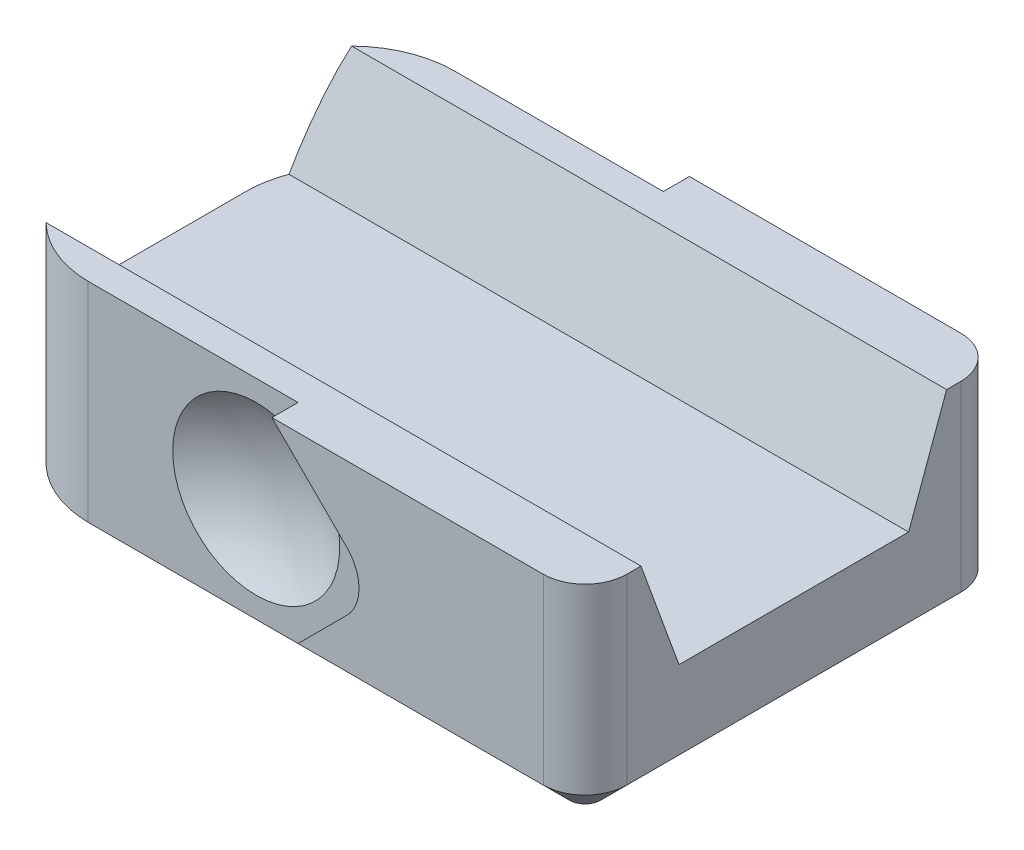
ISO-10303-21;
HEADER;
FILE_DESCRIPTION(('STEP AP214'),'2;1');
FILE_NAME('part.step','',(''),(''),'','','');
FILE_SCHEMA(('AUTOMOTIVE_DESIGN { 1 0 10303 214 1 1 1 1 }'));
ENDSEC;
DATA;
#1=APPLICATION_CONTEXT('core data for automotive mechanical design processes');
#2=APPLICATION_PROTOCOL_DEFINITION('international standard','automotive_design',2000,#1);
#3=PRODUCT_CONTEXT('',#1,'mechanical');
#4=PRODUCT('Part','Part','',(#3));
#5=PRODUCT_RELATED_PRODUCT_CATEGORY('part','',(#4));
#6=PRODUCT_DEFINITION_FORMATION('','',#4);
#7=PRODUCT_DEFINITION_CONTEXT('part definition',#1,'design');
#8=PRODUCT_DEFINITION('design','',#6,#7);
#9=PRODUCT_DEFINITION_SHAPE('','',#8);
#10=(LENGTH_UNIT() NAMED_UNIT(*) SI_UNIT(.MILLI.,.METRE.));
#11=(NAMED_UNIT(*) PLANE_ANGLE_UNIT() SI_UNIT($,.RADIAN.));
#12=(NAMED_UNIT(*) SI_UNIT($,.STERADIAN.) SOLID_ANGLE_UNIT());
#13=UNCERTAINTY_MEASURE_WITH_UNIT(LENGTH_MEASURE(1.E-05),#10,'distance_accuracy_value','');
#14=(GEOMETRIC_REPRESENTATION_CONTEXT(3) GLOBAL_UNCERTAINTY_ASSIGNED_CONTEXT((#13)) GLOBAL_UNIT_ASSIGNED_CONTEXT((#10,
#11,#12)) REPRESENTATION_CONTEXT('',''));
#15=CARTESIAN_POINT('',(0.,0.,0.));
#16=DIRECTION('',(0.,0.,1.));
#17=DIRECTION('',(1.,0.,0.));
#18=AXIS2_PLACEMENT_3D('',#15,#16,#17);
#19=CARTESIAN_POINT('',(-11.1891572936208,12.7,-12.7));
#20=DIRECTION('',(0.,0.,1.));
#21=DIRECTION('',(1.,0.,0.));
#22=AXIS2_PLACEMENT_3D('',#19,#20,#21);
#23=PLANE('',#22);
#24=DIRECTION('',(0.,-1.,0.));
#25=VECTOR('',#24,1.);
#26=CARTESIAN_POINT('',(16.51,12.7,-12.7));
#27=LINE('',#26,#25);
#28=CARTESIAN_POINT('',(16.51,12.7,-12.7));
#29=VERTEX_POINT('',#28);
#30=CARTESIAN_POINT('',(16.51,1.58750000000001,-12.7));
#31=VERTEX_POINT('',#30);
#32=EDGE_CURVE('E364',#29,#31,#27,.T.);
#33=ORIENTED_EDGE('',*,*,#32,.T.);
#34=DIRECTION('',(-1.,0.,0.));
#35=VECTOR('',#34,1.);
#36=CARTESIAN_POINT('',(-11.1891572936208,1.58750000000001,-12.7));
#37=LINE('',#36,#35);
#38=CARTESIAN_POINT('',(1.58749999999998,1.58750000000001,-12.7));
#39=VERTEX_POINT('',#38);
#40=EDGE_CURVE('E56',#31,#39,#37,.T.);
#41=ORIENTED_EDGE('',*,*,#40,.T.);
#42=DIRECTION('',(0.707106781186551,0.707106781186544,0.));
#43=VECTOR('',#42,1.);
#44=CARTESIAN_POINT('',(4.55394877578618,4.55394877578617,-12.7));
#45=LINE('',#44,#43);
#46=CARTESIAN_POINT('',(4.55394877578618,4.55394877578617,-12.7));
#47=VERTEX_POINT('',#46);
#48=EDGE_CURVE('E231',#39,#47,#45,.T.);
#49=ORIENTED_EDGE('',*,*,#48,.T.);
#50=CARTESIAN_POINT('',(2.75789755157236,6.35000000000001,-12.7));
#51=DIRECTION('',(0.,0.,1.));
#52=DIRECTION('',(1.,0.,0.));
#53=AXIS2_PLACEMENT_3D('',#50,#51,#52);
#54=CIRCLE('',#53,2.54);
#55=CARTESIAN_POINT('',(4.55394877578619,8.14605122421384,-12.7));
#56=VERTEX_POINT('',#55);
#57=EDGE_CURVE('E477',#47,#56,#54,.T.);
#58=ORIENTED_EDGE('',*,*,#57,.T.);
#59=DIRECTION('',(-0.707106781186546,0.707106781186549,0.));
#60=VECTOR('',#59,1.);
#61=CARTESIAN_POINT('',(0.,12.7,-12.7));
#62=LINE('',#61,#60);
#63=CARTESIAN_POINT('',(0.,12.7,-12.7));
#64=VERTEX_POINT('',#63);
#65=EDGE_CURVE('E472',#56,#64,#62,.T.);
#66=ORIENTED_EDGE('',*,*,#65,.T.);
#67=DIRECTION('',(-1.,0.,0.));
#68=VECTOR('',#67,1.);
#69=CARTESIAN_POINT('',(-11.1891572936208,12.7,-12.7));
#70=LINE('',#69,#68);
#71=EDGE_CURVE('E236',#29,#64,#70,.T.);
#72=ORIENTED_EDGE('',*,*,#71,.F.);
#73=EDGE_LOOP('',(#33,#41,#49,#58,#66,#72));
#74=FACE_BOUND('',#73,.T.);
#75=ADVANCED_FACE('F45',(#74),#23,.F.);
#76=CARTESIAN_POINT('',(-12.7771256866071,12.7,-11.1120316070137));
#77=DIRECTION('',(0.707106781186549,0.,0.707106781186546));
#78=DIRECTION('',(0.707106781186546,0.,-0.707106781186549));
#79=AXIS2_PLACEMENT_3D('',#76,#77,#78);
#80=PLANE('',#79);
#81=DIRECTION('',(0.,1.,0.));
#82=VECTOR('',#81,1.);
#83=CARTESIAN_POINT('',(-12.7766572936208,12.7,-11.1125));
#84=LINE('',#83,#82);
#85=CARTESIAN_POINT('',(-12.7766572936208,0.,-11.1125));
#86=VERTEX_POINT('',#85);
#87=CARTESIAN_POINT('',(-12.7766572936208,12.7,-11.1125));
#88=VERTEX_POINT('',#87);
#89=EDGE_CURVE('E227',#86,#88,#84,.T.);
#90=ORIENTED_EDGE('',*,*,#89,.F.);
#91=DIRECTION('',(-0.707106781186546,0.,0.707106781186549));
#92=VECTOR('',#91,1.);
#93=CARTESIAN_POINT('',(-12.7771256866071,0.,-11.1120316070137));
#94=LINE('',#93,#92);
#95=CARTESIAN_POINT('',(-12.7771256866071,0.,-11.1120316070137));
#96=VERTEX_POINT('',#95);
#97=EDGE_CURVE('E345',#86,#96,#94,.T.);
#98=ORIENTED_EDGE('',*,*,#97,.T.);
#99=DIRECTION('',(0.,-1.,0.));
#100=VECTOR('',#99,1.);
#101=CARTESIAN_POINT('',(-12.7771256866071,12.7,-11.1120316070137));
#102=LINE('',#101,#100);
#103=CARTESIAN_POINT('',(-12.7771256866071,12.7,-11.1120316070137));
#104=VERTEX_POINT('',#103);
#105=EDGE_CURVE('E360',#104,#96,#102,.T.);
#106=ORIENTED_EDGE('',*,*,#105,.F.);
#107=DIRECTION('',(-0.707106781186546,0.,0.707106781186549));
#108=VECTOR('',#107,1.);
#109=CARTESIAN_POINT('',(-12.7771256866071,12.7,-11.1120316070137));
#110=LINE('',#109,#108);
#111=EDGE_CURVE('E331',#88,#104,#110,.T.);
#112=ORIENTED_EDGE('',*,*,#111,.F.);
#113=EDGE_LOOP('',(#90,#98,#106,#112));
#114=FACE_BOUND('',#113,.T.);
#115=ADVANCED_FACE('F507',(#114),#80,.F.);
#116=CARTESIAN_POINT('',(-12.7,12.7,4.76250000000001));
#117=DIRECTION('',(0.,1.,0.));
#118=DIRECTION('',(0.,0.,1.));
#119=AXIS2_PLACEMENT_3D('',#116,#117,#118);
#120=PLANE('',#119);
#121=ORIENTED_EDGE('',*,*,#71,.T.);
#122=DIRECTION('',(0.,0.,-1.));
#123=VECTOR('',#122,1.);
#124=CARTESIAN_POINT('',(0.,12.7,-11.1125));
#125=LINE('',#124,#123);
#126=CARTESIAN_POINT('',(0.,12.7,-11.1125));
#127=VERTEX_POINT('',#126);
#128=EDGE_CURVE('E215',#127,#64,#125,.T.);
#129=ORIENTED_EDGE('',*,*,#128,.F.);
#130=DIRECTION('',(-1.,0.,0.));
#131=VECTOR('',#130,1.);
#132=CARTESIAN_POINT('',(-19.05,12.7,-11.1125));
#133=LINE('',#132,#131);
#134=EDGE_CURVE('E222',#127,#88,#133,.T.);
#135=ORIENTED_EDGE('',*,*,#134,.T.);
#136=ORIENTED_EDGE('',*,*,#111,.T.);
#137=CARTESIAN_POINT('',(-12.7,12.7,-4.7625));
#138=DIRECTION('',(0.,1.,0.));
#139=DIRECTION('',(0.,0.,-1.));
#140=AXIS2_PLACEMENT_3D('',#137,#138,#139);
#141=CIRCLE('',#140,6.35);
#142=CARTESIAN_POINT('',(-17.1461179337713,12.7,-9.29621098759031));
#143=VERTEX_POINT('',#142);
#144=EDGE_CURVE('E334',#104,#143,#141,.T.);
#145=ORIENTED_EDGE('',*,*,#144,.T.);
#146=DIRECTION('',(-1.,0.,0.));
#147=VECTOR('',#146,1.);
#148=CARTESIAN_POINT('',(19.05,12.7,-9.29621098759031));
#149=LINE('',#148,#147);
#150=CARTESIAN_POINT('',(19.05,12.7,-9.29621098759031));
#151=VERTEX_POINT('',#150);
#152=EDGE_CURVE('E405',#143,#151,#149,.F.);
#153=ORIENTED_EDGE('',*,*,#152,.T.);
#154=DIRECTION('',(0.,0.,-1.));
#155=VECTOR('',#154,1.);
#156=CARTESIAN_POINT('',(19.05,12.7,10.16));
#157=LINE('',#156,#155);
#158=CARTESIAN_POINT('',(19.05,12.7,-10.16));
#159=VERTEX_POINT('',#158);
#160=EDGE_CURVE('E322',#151,#159,#157,.T.);
#161=ORIENTED_EDGE('',*,*,#160,.T.);
#162=CARTESIAN_POINT('',(16.51,12.7,-10.16));
#163=DIRECTION('',(0.,1.,0.));
#164=DIRECTION('',(0.,0.,-1.));
#165=AXIS2_PLACEMENT_3D('',#162,#163,#164);
#166=CIRCLE('',#165,2.54);
#167=EDGE_CURVE('E326',#159,#29,#166,.T.);
#168=ORIENTED_EDGE('',*,*,#167,.T.);
#169=EDGE_LOOP('',(#121,#129,#135,#136,#145,#153,#161,#168));
#170=FACE_BOUND('',#169,.T.);
#171=ADVANCED_FACE('F234',(#170),#120,.T.);
#172=CARTESIAN_POINT('',(-12.7,0.,4.76250000000001));
#173=DIRECTION('',(0.,1.,0.));
#174=DIRECTION('',(0.,0.,1.));
#175=AXIS2_PLACEMENT_3D('',#172,#173,#174);
#176=PLANE('',#175);
#177=CARTESIAN_POINT('',(16.51,0.,10.16));
#178=DIRECTION('',(0.,1.,0.));
#179=DIRECTION('',(0.,0.,1.));
#180=AXIS2_PLACEMENT_3D('',#177,#178,#179);
#181=CIRCLE('',#180,0.9525);
#182=CARTESIAN_POINT('',(17.4625,0.,10.16));
#183=VERTEX_POINT('',#182);
#184=CARTESIAN_POINT('',(16.51,0.,11.1125));
#185=VERTEX_POINT('',#184);
#186=EDGE_CURVE('E432',#183,#185,#181,.F.);
#187=ORIENTED_EDGE('',*,*,#186,.T.);
#188=DIRECTION('',(-1.,0.,0.));
#189=VECTOR('',#188,1.);
#190=CARTESIAN_POINT('',(-12.7,0.,11.1125));
#191=LINE('',#190,#189);
#192=CARTESIAN_POINT('',(0.,0.,11.1125));
#193=VERTEX_POINT('',#192);
#194=EDGE_CURVE('E435',#185,#193,#191,.T.);
#195=ORIENTED_EDGE('',*,*,#194,.T.);
#196=DIRECTION('',(1.,0.,0.));
#197=VECTOR('',#196,1.);
#198=CARTESIAN_POINT('',(-12.7,0.,11.1125));
#199=LINE('',#198,#197);
#200=CARTESIAN_POINT('',(-12.7766572936208,0.,11.1125));
#201=VERTEX_POINT('',#200);
#202=EDGE_CURVE('E412',#201,#193,#199,.T.);
#203=ORIENTED_EDGE('',*,*,#202,.F.);
#204=DIRECTION('',(0.707106781186546,0.,0.707106781186549));
#205=VECTOR('',#204,1.);
#206=CARTESIAN_POINT('',(-12.7771256866071,0.,11.1120316070137));
#207=LINE('',#206,#205);
#208=CARTESIAN_POINT('',(-12.7771256866071,0.,11.1120316070137));
#209=VERTEX_POINT('',#208);
#210=EDGE_CURVE('E341',#209,#201,#207,.T.);
#211=ORIENTED_EDGE('',*,*,#210,.F.);
#212=CARTESIAN_POINT('',(-12.7,0.,4.76250000000001));
#213=DIRECTION('',(0.,1.,0.));
#214=DIRECTION('',(0.,0.,1.));
#215=AXIS2_PLACEMENT_3D('',#212,#213,#214);
#216=CIRCLE('',#215,6.35);
#217=CARTESIAN_POINT('',(-19.05,0.,4.7625));
#218=VERTEX_POINT('',#217);
#219=EDGE_CURVE('E307',#218,#209,#216,.T.);
#220=ORIENTED_EDGE('',*,*,#219,.F.);
#221=DIRECTION('',(0.,0.,1.));
#222=VECTOR('',#221,1.);
#223=CARTESIAN_POINT('',(-19.05,0.,4.7625));
#224=LINE('',#223,#222);
#225=CARTESIAN_POINT('',(-19.05,0.,-4.7625));
#226=VERTEX_POINT('',#225);
#227=EDGE_CURVE('E312',#226,#218,#224,.T.);
#228=ORIENTED_EDGE('',*,*,#227,.F.);
#229=CARTESIAN_POINT('',(-12.7,0.,-4.7625));
#230=DIRECTION('',(0.,1.,0.));
#231=DIRECTION('',(0.,0.,-1.));
#232=AXIS2_PLACEMENT_3D('',#229,#230,#231);
#233=CIRCLE('',#232,6.35);
#234=EDGE_CURVE('E348',#96,#226,#233,.T.);
#235=ORIENTED_EDGE('',*,*,#234,.F.);
#236=ORIENTED_EDGE('',*,*,#97,.F.);
#237=DIRECTION('',(-1.,0.,0.));
#238=VECTOR('',#237,1.);
#239=CARTESIAN_POINT('',(-12.7,0.,-11.1125));
#240=LINE('',#239,#238);
#241=CARTESIAN_POINT('',(0.,0.,-11.1125));
#242=VERTEX_POINT('',#241);
#243=EDGE_CURVE('E416',#242,#86,#240,.T.);
#244=ORIENTED_EDGE('',*,*,#243,.F.);
#245=DIRECTION('',(1.,0.,0.));
#246=VECTOR('',#245,1.);
#247=CARTESIAN_POINT('',(-12.7,0.,-11.1125));
#248=LINE('',#247,#246);
#249=CARTESIAN_POINT('',(16.51,0.,-11.1125));
#250=VERTEX_POINT('',#249);
#251=EDGE_CURVE('E423',#242,#250,#248,.T.);
#252=ORIENTED_EDGE('',*,*,#251,.T.);
#253=CARTESIAN_POINT('',(16.51,0.,-10.16));
#254=DIRECTION('',(0.,1.,0.));
#255=DIRECTION('',(0.,0.,1.));
#256=AXIS2_PLACEMENT_3D('',#253,#254,#255);
#257=CIRCLE('',#256,0.952499999999998);
#258=CARTESIAN_POINT('',(17.4625,0.,-10.16));
#259=VERTEX_POINT('',#258);
#260=EDGE_CURVE('E426',#250,#259,#257,.F.);
#261=ORIENTED_EDGE('',*,*,#260,.T.);
#262=DIRECTION('',(0.,0.,1.));
#263=VECTOR('',#262,1.);
#264=CARTESIAN_POINT('',(17.4625,0.,4.76250000000001));
#265=LINE('',#264,#263);
#266=EDGE_CURVE('E429',#259,#183,#265,.T.);
#267=ORIENTED_EDGE('',*,*,#266,.T.);
#268=EDGE_LOOP('',(#187,#195,#203,#211,#220,#228,#235,#236,#244,#252,#261,#267));
#269=FACE_BOUND('',#268,.T.);
#270=ADVANCED_FACE('F502',(#269),#176,.F.);
#271=CARTESIAN_POINT('',(-12.7771256866071,12.7,11.1120316070137));
#272=DIRECTION('',(0.707106781186549,0.,-0.707106781186546));
#273=DIRECTION('',(-0.707106781186546,0.,-0.707106781186549));
#274=AXIS2_PLACEMENT_3D('',#271,#272,#273);
#275=PLANE('',#274);
#276=DIRECTION('',(0.,-1.,0.));
#277=VECTOR('',#276,1.);
#278=CARTESIAN_POINT('',(-12.7766572936208,12.7,11.1125));
#279=LINE('',#278,#277);
#280=CARTESIAN_POINT('',(-12.7766572936208,12.7,11.1125));
#281=VERTEX_POINT('',#280);
#282=EDGE_CURVE('E283',#281,#201,#279,.T.);
#283=ORIENTED_EDGE('',*,*,#282,.F.);
#284=DIRECTION('',(0.707106781186546,0.,0.707106781186549));
#285=VECTOR('',#284,1.);
#286=CARTESIAN_POINT('',(-12.7771256866071,12.7,11.1120316070137));
#287=LINE('',#286,#285);
#288=CARTESIAN_POINT('',(-12.7771256866071,12.7,11.1120316070137));
#289=VERTEX_POINT('',#288);
#290=EDGE_CURVE('E311',#289,#281,#287,.T.);
#291=ORIENTED_EDGE('',*,*,#290,.F.);
#292=DIRECTION('',(0.,-1.,0.));
#293=VECTOR('',#292,1.);
#294=CARTESIAN_POINT('',(-12.7771256866071,12.7,11.1120316070137));
#295=LINE('',#294,#293);
#296=EDGE_CURVE('E378',#289,#209,#295,.T.);
#297=ORIENTED_EDGE('',*,*,#296,.T.);
#298=ORIENTED_EDGE('',*,*,#210,.T.);
#299=EDGE_LOOP('',(#283,#291,#297,#298));
#300=FACE_BOUND('',#299,.T.);
#301=ADVANCED_FACE('F569',(#300),#275,.F.);
#302=DIRECTION('',(0.,0.,1.));
#303=VECTOR('',#302,1.);
#304=CARTESIAN_POINT('',(0.,12.7,11.1125));
#305=LINE('',#304,#303);
#306=CARTESIAN_POINT('',(0.,12.7,11.1125));
#307=VERTEX_POINT('',#306);
#308=CARTESIAN_POINT('',(0.,12.7,12.7));
#309=VERTEX_POINT('',#308);
#310=EDGE_CURVE('E279',#307,#309,#305,.T.);
#311=ORIENTED_EDGE('',*,*,#310,.T.);
#312=DIRECTION('',(1.,0.,0.));
#313=VECTOR('',#312,1.);
#314=CARTESIAN_POINT('',(-11.1891572936208,12.7,12.7));
#315=LINE('',#314,#313);
#316=CARTESIAN_POINT('',(16.51,12.7,12.7));
#317=VERTEX_POINT('',#316);
#318=EDGE_CURVE('E316',#309,#317,#315,.T.);
#319=ORIENTED_EDGE('',*,*,#318,.T.);
#320=CARTESIAN_POINT('',(16.51,12.7,10.16));
#321=DIRECTION('',(0.,1.,0.));
#322=DIRECTION('',(0.,0.,1.));
#323=AXIS2_PLACEMENT_3D('',#320,#321,#322);
#324=CIRCLE('',#323,2.54);
#325=CARTESIAN_POINT('',(19.05,12.7,10.16));
#326=VERTEX_POINT('',#325);
#327=EDGE_CURVE('E319',#317,#326,#324,.T.);
#328=ORIENTED_EDGE('',*,*,#327,.T.);
#329=CARTESIAN_POINT('',(19.05,12.7,9.29621098759031));
#330=VERTEX_POINT('',#329);
#331=EDGE_CURVE('E323',#326,#330,#157,.T.);
#332=ORIENTED_EDGE('',*,*,#331,.T.);
#333=DIRECTION('',(1.,0.,0.));
#334=VECTOR('',#333,1.);
#335=CARTESIAN_POINT('',(19.05,12.7,9.29621098759031));
#336=LINE('',#335,#334);
#337=CARTESIAN_POINT('',(-17.1461179337713,12.7,9.29621098759031));
#338=VERTEX_POINT('',#337);
#339=EDGE_CURVE('E390',#330,#338,#336,.F.);
#340=ORIENTED_EDGE('',*,*,#339,.T.);
#341=CARTESIAN_POINT('',(-12.7,12.7,4.76250000000001));
#342=DIRECTION('',(0.,1.,0.));
#343=DIRECTION('',(0.,0.,1.));
#344=AXIS2_PLACEMENT_3D('',#341,#342,#343);
#345=CIRCLE('',#344,6.35);
#346=EDGE_CURVE('E308',#338,#289,#345,.T.);
#347=ORIENTED_EDGE('',*,*,#346,.T.);
#348=ORIENTED_EDGE('',*,*,#290,.T.);
#349=DIRECTION('',(-1.,0.,0.));
#350=VECTOR('',#349,1.);
#351=CARTESIAN_POINT('',(-19.05,12.7,11.1125));
#352=LINE('',#351,#350);
#353=EDGE_CURVE('E267',#307,#281,#352,.T.);
#354=ORIENTED_EDGE('',*,*,#353,.F.);
#355=EDGE_LOOP('',(#311,#319,#328,#332,#340,#347,#348,#354));
#356=FACE_BOUND('',#355,.T.);
#357=ADVANCED_FACE('F532',(#356),#120,.T.);
#358=CARTESIAN_POINT('',(-12.7,12.7,4.76250000000001));
#359=DIRECTION('',(0.,-1.,0.));
#360=DIRECTION('',(0.,0.,-1.));
#361=AXIS2_PLACEMENT_3D('',#358,#359,#360);
#362=CYLINDRICAL_SURFACE('',#361,6.35);
#363=ORIENTED_EDGE('',*,*,#346,.F.);
#364=CARTESIAN_POINT('',(-12.7,0.243731435262207,4.76250000000001));
#365=DIRECTION('',(0.,0.342020143325665,-0.93969262078591));
#366=DIRECTION('',(0.,-0.93969262078591,-0.342020143325665));
#367=AXIS2_PLACEMENT_3D('',#364,#365,#366);
#368=ELLIPSE('',#367,18.5661579410358,6.35);
#369=CARTESIAN_POINT('',(-18.6483605934745,6.35,6.98499999999995));
#370=VERTEX_POINT('',#369);
#371=EDGE_CURVE('E394',#338,#370,#368,.F.);
#372=ORIENTED_EDGE('',*,*,#371,.T.);
#373=CARTESIAN_POINT('',(-12.7,6.35,4.76250000000001));
#374=DIRECTION('',(0.,-1.,0.));
#375=DIRECTION('',(0.,0.,-1.));
#376=AXIS2_PLACEMENT_3D('',#373,#374,#375);
#377=CIRCLE('',#376,6.35);
#378=CARTESIAN_POINT('',(-19.05,6.35,4.7625));
#379=VERTEX_POINT('',#378);
#380=EDGE_CURVE('E304',#370,#379,#377,.T.);
#381=ORIENTED_EDGE('',*,*,#380,.T.);
#382=DIRECTION('',(0.,-1.,0.));
#383=VECTOR('',#382,1.);
#384=CARTESIAN_POINT('',(-19.05,12.7,4.7625));
#385=LINE('',#384,#383);
#386=EDGE_CURVE('E337',#379,#218,#385,.T.);
#387=ORIENTED_EDGE('',*,*,#386,.T.);
#388=ORIENTED_EDGE('',*,*,#219,.T.);
#389=ORIENTED_EDGE('',*,*,#296,.F.);
#390=EDGE_LOOP('',(#363,#372,#381,#387,#388,#389));
#391=FACE_BOUND('',#390,.T.);
#392=ADVANCED_FACE('F571',(#391),#362,.T.);
#393=CARTESIAN_POINT('',(-11.1891572936208,12.7,12.7));
#394=DIRECTION('',(0.,0.,-1.));
#395=DIRECTION('',(-1.,0.,0.));
#396=AXIS2_PLACEMENT_3D('',#393,#394,#395);
#397=PLANE('',#396);
#398=DIRECTION('',(0.707106781186551,0.707106781186544,0.));
#399=VECTOR('',#398,1.);
#400=CARTESIAN_POINT('',(4.55394877578618,4.55394877578617,12.7));
#401=LINE('',#400,#399);
#402=CARTESIAN_POINT('',(1.58749999999998,1.58750000000001,12.7));
#403=VERTEX_POINT('',#402);
#404=CARTESIAN_POINT('',(4.55394877578618,4.55394877578617,12.7));
#405=VERTEX_POINT('',#404);
#406=EDGE_CURVE('E253',#403,#405,#401,.T.);
#407=ORIENTED_EDGE('',*,*,#406,.F.);
#408=DIRECTION('',(1.,0.,0.));
#409=VECTOR('',#408,1.);
#410=CARTESIAN_POINT('',(-11.1891572936208,1.58750000000001,12.7));
#411=LINE('',#410,#409);
#412=CARTESIAN_POINT('',(16.51,1.58750000000001,12.7));
#413=VERTEX_POINT('',#412);
#414=EDGE_CURVE('E419',#403,#413,#411,.T.);
#415=ORIENTED_EDGE('',*,*,#414,.T.);
#416=DIRECTION('',(0.,-1.,0.));
#417=VECTOR('',#416,1.);
#418=CARTESIAN_POINT('',(16.51,12.7,12.7));
#419=LINE('',#418,#417);
#420=EDGE_CURVE('E374',#317,#413,#419,.T.);
#421=ORIENTED_EDGE('',*,*,#420,.F.);
#422=ORIENTED_EDGE('',*,*,#318,.F.);
#423=DIRECTION('',(-0.707106781186546,0.707106781186549,0.));
#424=VECTOR('',#423,1.);
#425=CARTESIAN_POINT('',(0.,12.7,12.7));
#426=LINE('',#425,#424);
#427=CARTESIAN_POINT('',(4.55394877578619,8.14605122421384,12.7));
#428=VERTEX_POINT('',#427);
#429=EDGE_CURVE('E259',#428,#309,#426,.T.);
#430=ORIENTED_EDGE('',*,*,#429,.F.);
#431=CARTESIAN_POINT('',(2.75789755157236,6.35000000000001,12.7));
#432=DIRECTION('',(0.,0.,1.));
#433=DIRECTION('',(1.,0.,0.));
#434=AXIS2_PLACEMENT_3D('',#431,#432,#433);
#435=CIRCLE('',#434,2.54);
#436=EDGE_CURVE('E273',#405,#428,#435,.T.);
#437=ORIENTED_EDGE('',*,*,#436,.F.);
#438=EDGE_LOOP('',(#407,#415,#421,#422,#430,#437));
#439=FACE_BOUND('',#438,.T.);
#440=ADVANCED_FACE('F547',(#439),#397,.F.);
#441=CARTESIAN_POINT('',(16.51,12.7,10.16));
#442=DIRECTION('',(0.,-1.,0.));
#443=DIRECTION('',(0.,0.,-1.));
#444=AXIS2_PLACEMENT_3D('',#441,#442,#443);
#445=CYLINDRICAL_SURFACE('',#444,2.54);
#446=ORIENTED_EDGE('',*,*,#420,.T.);
#447=CARTESIAN_POINT('',(16.51,1.58750000000001,10.16));
#448=DIRECTION('',(0.,1.,0.));
#449=DIRECTION('',(0.,0.,1.));
#450=AXIS2_PLACEMENT_3D('',#447,#448,#449);
#451=CIRCLE('',#450,2.54);
#452=CARTESIAN_POINT('',(19.05,1.58750000000001,10.16));
#453=VERTEX_POINT('',#452);
#454=EDGE_CURVE('E441',#413,#453,#451,.T.);
#455=ORIENTED_EDGE('',*,*,#454,.T.);
#456=DIRECTION('',(0.,-1.,0.));
#457=VECTOR('',#456,1.);
#458=CARTESIAN_POINT('',(19.05,12.7,10.16));
#459=LINE('',#458,#457);
#460=EDGE_CURVE('E370',#326,#453,#459,.T.);
#461=ORIENTED_EDGE('',*,*,#460,.F.);
#462=ORIENTED_EDGE('',*,*,#327,.F.);
#463=EDGE_LOOP('',(#446,#455,#461,#462));
#464=FACE_BOUND('',#463,.T.);
#465=ADVANCED_FACE('F537',(#464),#445,.T.);
#466=CARTESIAN_POINT('',(19.05,12.7,10.16));
#467=DIRECTION('',(-1.,0.,0.));
#468=DIRECTION('',(0.,0.,1.));
#469=AXIS2_PLACEMENT_3D('',#466,#467,#468);
#470=PLANE('',#469);
#471=ORIENTED_EDGE('',*,*,#460,.T.);
#472=DIRECTION('',(0.,0.,-1.));
#473=VECTOR('',#472,1.);
#474=CARTESIAN_POINT('',(19.05,1.58750000000001,10.16));
#475=LINE('',#474,#473);
#476=CARTESIAN_POINT('',(19.05,1.58750000000001,-10.16));
#477=VERTEX_POINT('',#476);
#478=EDGE_CURVE('E444',#453,#477,#475,.T.);
#479=ORIENTED_EDGE('',*,*,#478,.T.);
#480=DIRECTION('',(0.,-1.,0.));
#481=VECTOR('',#480,1.);
#482=CARTESIAN_POINT('',(19.05,12.7,-10.16));
#483=LINE('',#482,#481);
#484=EDGE_CURVE('E367',#159,#477,#483,.T.);
#485=ORIENTED_EDGE('',*,*,#484,.F.);
#486=ORIENTED_EDGE('',*,*,#160,.F.);
#487=DIRECTION('',(0.,0.93969262078591,-0.342020143325665));
#488=VECTOR('',#487,1.);
#489=CARTESIAN_POINT('',(19.05,6.44689432286497,-7.02026664939218));
#490=LINE('',#489,#488);
#491=CARTESIAN_POINT('',(19.05,6.35,-6.98499999999996));
#492=VERTEX_POINT('',#491);
#493=EDGE_CURVE('E409',#151,#492,#490,.F.);
#494=ORIENTED_EDGE('',*,*,#493,.T.);
#495=DIRECTION('',(0.,0.,1.));
#496=VECTOR('',#495,1.);
#497=CARTESIAN_POINT('',(19.05,6.35,-9.525));
#498=LINE('',#497,#496);
#499=CARTESIAN_POINT('',(19.05,6.35,6.98499999999994));
#500=VERTEX_POINT('',#499);
#501=EDGE_CURVE('E293',#492,#500,#498,.T.);
#502=ORIENTED_EDGE('',*,*,#501,.T.);
#503=DIRECTION('',(0.,-0.93969262078591,-0.342020143325665));
#504=VECTOR('',#503,1.);
#505=CARTESIAN_POINT('',(19.05,12.9776164372802,9.39725510730332));
#506=LINE('',#505,#504);
#507=EDGE_CURVE('E397',#500,#330,#506,.F.);
#508=ORIENTED_EDGE('',*,*,#507,.T.);
#509=ORIENTED_EDGE('',*,*,#331,.F.);
#510=EDGE_LOOP('',(#471,#479,#485,#486,#494,#502,#508,#509));
#511=FACE_BOUND('',#510,.T.);
#512=ADVANCED_FACE('F520',(#511),#470,.F.);
#513=CARTESIAN_POINT('',(16.51,12.7,-10.16));
#514=DIRECTION('',(0.,-1.,0.));
#515=DIRECTION('',(0.,0.,-1.));
#516=AXIS2_PLACEMENT_3D('',#513,#514,#515);
#517=CYLINDRICAL_SURFACE('',#516,2.54);
#518=ORIENTED_EDGE('',*,*,#484,.T.);
#519=CARTESIAN_POINT('',(16.51,1.58750000000001,-10.16));
#520=DIRECTION('',(0.,1.,0.));
#521=DIRECTION('',(0.,0.,1.));
#522=AXIS2_PLACEMENT_3D('',#519,#520,#521);
#523=CIRCLE('',#522,2.54);
#524=EDGE_CURVE('E71',#477,#31,#523,.T.);
#525=ORIENTED_EDGE('',*,*,#524,.T.);
#526=ORIENTED_EDGE('',*,*,#32,.F.);
#527=ORIENTED_EDGE('',*,*,#167,.F.);
#528=EDGE_LOOP('',(#518,#525,#526,#527));
#529=FACE_BOUND('',#528,.T.);
#530=ADVANCED_FACE('F584',(#529),#517,.T.);
#531=CARTESIAN_POINT('',(-12.7,12.7,-4.7625));
#532=DIRECTION('',(0.,-1.,0.));
#533=DIRECTION('',(0.,0.,-1.));
#534=AXIS2_PLACEMENT_3D('',#531,#532,#533);
#535=CYLINDRICAL_SURFACE('',#534,6.35);
#536=DIRECTION('',(0.,-1.,0.));
#537=VECTOR('',#536,1.);
#538=CARTESIAN_POINT('',(-19.05,12.7,-4.7625));
#539=LINE('',#538,#537);
#540=CARTESIAN_POINT('',(-19.05,6.35,-4.7625));
#541=VERTEX_POINT('',#540);
#542=EDGE_CURVE('E357',#541,#226,#539,.T.);
#543=ORIENTED_EDGE('',*,*,#542,.F.);
#544=CARTESIAN_POINT('',(-12.7,6.35,-4.7625));
#545=DIRECTION('',(0.,-1.,0.));
#546=DIRECTION('',(0.,0.,-1.));
#547=AXIS2_PLACEMENT_3D('',#544,#545,#546);
#548=CIRCLE('',#547,6.35);
#549=CARTESIAN_POINT('',(-18.6483605934745,6.35,-6.98499999999996));
#550=VERTEX_POINT('',#549);
#551=EDGE_CURVE('E297',#541,#550,#548,.T.);
#552=ORIENTED_EDGE('',*,*,#551,.T.);
#553=CARTESIAN_POINT('',(-12.7,0.243731435262162,-4.7625));
#554=DIRECTION('',(0.,0.342020143325665,0.93969262078591));
#555=DIRECTION('',(0.,-0.93969262078591,0.342020143325665));
#556=AXIS2_PLACEMENT_3D('',#553,#554,#555);
#557=ELLIPSE('',#556,18.5661579410358,6.35);
#558=EDGE_CURVE('E401',#550,#143,#557,.F.);
#559=ORIENTED_EDGE('',*,*,#558,.T.);
#560=ORIENTED_EDGE('',*,*,#144,.F.);
#561=ORIENTED_EDGE('',*,*,#105,.T.);
#562=ORIENTED_EDGE('',*,*,#234,.T.);
#563=EDGE_LOOP('',(#543,#552,#559,#560,#561,#562));
#564=FACE_BOUND('',#563,.T.);
#565=ADVANCED_FACE('F511',(#564),#535,.T.);
#566=CARTESIAN_POINT('',(-19.05,12.7,4.7625));
#567=DIRECTION('',(1.,0.,0.));
#568=DIRECTION('',(0.,0.,-1.));
#569=AXIS2_PLACEMENT_3D('',#566,#567,#568);
#570=PLANE('',#569);
#571=ORIENTED_EDGE('',*,*,#386,.F.);
#572=DIRECTION('',(0.,0.,1.));
#573=VECTOR('',#572,1.);
#574=CARTESIAN_POINT('',(-19.05,6.35,-9.525));
#575=LINE('',#574,#573);
#576=EDGE_CURVE('E292',#541,#379,#575,.T.);
#577=ORIENTED_EDGE('',*,*,#576,.F.);
#578=ORIENTED_EDGE('',*,*,#542,.T.);
#579=ORIENTED_EDGE('',*,*,#227,.T.);
#580=EDGE_LOOP('',(#571,#577,#578,#579));
#581=FACE_BOUND('',#580,.T.);
#582=ADVANCED_FACE('F575',(#581),#570,.F.);
#583=CARTESIAN_POINT('',(19.05,6.35,-9.525));
#584=DIRECTION('',(0.,-1.,0.));
#585=DIRECTION('',(0.,0.,-1.));
#586=AXIS2_PLACEMENT_3D('',#583,#584,#585);
#587=PLANE('',#586);
#588=ORIENTED_EDGE('',*,*,#380,.F.);
#589=DIRECTION('',(1.,0.,0.));
#590=VECTOR('',#589,1.);
#591=CARTESIAN_POINT('',(19.05,6.35,6.98499999999995));
#592=LINE('',#591,#590);
#593=EDGE_CURVE('E386',#370,#500,#592,.T.);
#594=ORIENTED_EDGE('',*,*,#593,.T.);
#595=ORIENTED_EDGE('',*,*,#501,.F.);
#596=DIRECTION('',(-1.,0.,0.));
#597=VECTOR('',#596,1.);
#598=CARTESIAN_POINT('',(-16.900130206315,6.35,-6.98499999999996));
#599=LINE('',#598,#597);
#600=EDGE_CURVE('E382',#492,#550,#599,.T.);
#601=ORIENTED_EDGE('',*,*,#600,.T.);
#602=ORIENTED_EDGE('',*,*,#551,.F.);
#603=ORIENTED_EDGE('',*,*,#576,.T.);
#604=EDGE_LOOP('',(#588,#594,#595,#601,#602,#603));
#605=FACE_BOUND('',#604,.T.);
#606=ADVANCED_FACE('F523',(#605),#587,.F.);
#607=CARTESIAN_POINT('',(19.05,13.3285926454149,9.52499999999998));
#608=DIRECTION('',(0.,0.342020143325665,-0.93969262078591));
#609=DIRECTION('',(1.,0.,0.));
#610=AXIS2_PLACEMENT_3D('',#607,#608,#609);
#611=PLANE('',#610);
#612=ORIENTED_EDGE('',*,*,#507,.F.);
#613=ORIENTED_EDGE('',*,*,#593,.F.);
#614=ORIENTED_EDGE('',*,*,#371,.F.);
#615=ORIENTED_EDGE('',*,*,#339,.F.);
#616=EDGE_LOOP('',(#612,#613,#614,#615));
#617=FACE_BOUND('',#616,.T.);
#618=ADVANCED_FACE('F527',(#617),#611,.T.);
#619=CARTESIAN_POINT('',(19.05,6.35,-6.98499999999996));
#620=DIRECTION('',(0.,0.342020143325665,0.93969262078591));
#621=DIRECTION('',(1.,0.,0.));
#622=AXIS2_PLACEMENT_3D('',#619,#620,#621);
#623=PLANE('',#622);
#624=ORIENTED_EDGE('',*,*,#493,.F.);
#625=ORIENTED_EDGE('',*,*,#152,.F.);
#626=ORIENTED_EDGE('',*,*,#558,.F.);
#627=ORIENTED_EDGE('',*,*,#600,.F.);
#628=EDGE_LOOP('',(#624,#625,#626,#627));
#629=FACE_BOUND('',#628,.T.);
#630=ADVANCED_FACE('F517',(#629),#623,.T.);
#631=CARTESIAN_POINT('',(2.75789755157236,6.35000000000001,11.1125));
#632=DIRECTION('',(0.,0.,1.));
#633=DIRECTION('',(1.,0.,0.));
#634=AXIS2_PLACEMENT_3D('',#631,#632,#633);
#635=PLANE('',#634);
#636=CARTESIAN_POINT('',(-2.53999999999997,6.35,11.1125));
#637=DIRECTION('',(0.,0.,-1.));
#638=DIRECTION('',(0.,1.,0.));
#639=AXIS2_PLACEMENT_3D('',#636,#637,#638);
#640=CIRCLE('',#639,5.08);
#641=CARTESIAN_POINT('',(-2.53999999999997,11.43,11.1125));
#642=VERTEX_POINT('',#641);
#643=EDGE_CURVE('E249',#642,#642,#640,.T.);
#644=ORIENTED_EDGE('',*,*,#643,.T.);
#645=EDGE_LOOP('',(#644));
#646=FACE_BOUND('',#645,.T.);
#647=ORIENTED_EDGE('',*,*,#282,.T.);
#648=ORIENTED_EDGE('',*,*,#202,.T.);
#649=DIRECTION('',(0.707106781186551,0.707106781186544,0.));
#650=VECTOR('',#649,1.);
#651=CARTESIAN_POINT('',(4.55394877578618,4.55394877578617,11.1125));
#652=LINE('',#651,#650);
#653=CARTESIAN_POINT('',(4.55394877578618,4.55394877578617,11.1125));
#654=VERTEX_POINT('',#653);
#655=EDGE_CURVE('E254',#193,#654,#652,.T.);
#656=ORIENTED_EDGE('',*,*,#655,.T.);
#657=CARTESIAN_POINT('',(2.75789755157236,6.35000000000001,11.1125));
#658=DIRECTION('',(0.,0.,1.));
#659=DIRECTION('',(1.,0.,0.));
#660=AXIS2_PLACEMENT_3D('',#657,#658,#659);
#661=CIRCLE('',#660,2.54);
#662=CARTESIAN_POINT('',(4.55394877578619,8.14605122421384,11.1125));
#663=VERTEX_POINT('',#662);
#664=EDGE_CURVE('E258',#654,#663,#661,.T.);
#665=ORIENTED_EDGE('',*,*,#664,.T.);
#666=DIRECTION('',(-0.707106781186546,0.707106781186549,0.));
#667=VECTOR('',#666,1.);
#668=CARTESIAN_POINT('',(0.,12.7,11.1125));
#669=LINE('',#668,#667);
#670=EDGE_CURVE('E263',#663,#307,#669,.T.);
#671=ORIENTED_EDGE('',*,*,#670,.T.);
#672=ORIENTED_EDGE('',*,*,#353,.T.);
#673=EDGE_LOOP('',(#647,#648,#656,#665,#671,#672));
#674=FACE_BOUND('',#673,.T.);
#675=ADVANCED_FACE('F556',(#646,#674),#635,.T.);
#676=CARTESIAN_POINT('',(0.,12.7,11.1125));
#677=DIRECTION('',(0.707106781186549,0.707106781186546,0.));
#678=DIRECTION('',(-0.707106781186546,0.707106781186549,0.));
#679=AXIS2_PLACEMENT_3D('',#676,#677,#678);
#680=PLANE('',#679);
#681=ORIENTED_EDGE('',*,*,#429,.T.);
#682=ORIENTED_EDGE('',*,*,#310,.F.);
#683=ORIENTED_EDGE('',*,*,#670,.F.);
#684=DIRECTION('',(0.,0.,1.));
#685=VECTOR('',#684,1.);
#686=CARTESIAN_POINT('',(4.55394877578619,8.14605122421384,11.1125));
#687=LINE('',#686,#685);
#688=EDGE_CURVE('E284',#663,#428,#687,.T.);
#689=ORIENTED_EDGE('',*,*,#688,.T.);
#690=EDGE_LOOP('',(#681,#682,#683,#689));
#691=FACE_BOUND('',#690,.T.);
#692=ADVANCED_FACE('F662',(#691),#680,.F.);
#693=CARTESIAN_POINT('',(2.75789755157236,6.35000000000001,11.1125));
#694=DIRECTION('',(0.,0.,1.));
#695=DIRECTION('',(1.,0.,0.));
#696=AXIS2_PLACEMENT_3D('',#693,#694,#695);
#697=CYLINDRICAL_SURFACE('',#696,2.54);
#698=ORIENTED_EDGE('',*,*,#436,.T.);
#699=ORIENTED_EDGE('',*,*,#688,.F.);
#700=ORIENTED_EDGE('',*,*,#664,.F.);
#701=DIRECTION('',(0.,0.,1.));
#702=VECTOR('',#701,1.);
#703=CARTESIAN_POINT('',(4.55394877578618,4.55394877578617,11.1125));
#704=LINE('',#703,#702);
#705=EDGE_CURVE('E270',#654,#405,#704,.T.);
#706=ORIENTED_EDGE('',*,*,#705,.T.);
#707=EDGE_LOOP('',(#698,#699,#700,#706));
#708=FACE_BOUND('',#707,.T.);
#709=ADVANCED_FACE('F562',(#708),#697,.F.);
#710=CARTESIAN_POINT('',(4.55394877578618,4.55394877578617,11.1125));
#711=DIRECTION('',(0.707106781186544,-0.707106781186551,0.));
#712=DIRECTION('',(0.707106781186551,0.707106781186544,0.));
#713=AXIS2_PLACEMENT_3D('',#710,#711,#712);
#714=PLANE('',#713);
#715=ORIENTED_EDGE('',*,*,#655,.F.);
#716=DIRECTION('',(-0.57735026918963,-0.577350269189624,-0.577350269189624));
#717=VECTOR('',#716,1.);
#718=CARTESIAN_POINT('',(-2.67138576454032,-2.67138576454026,8.44111423545974));
#719=LINE('',#718,#717);
#720=EDGE_CURVE('E438',#193,#403,#719,.F.);
#721=ORIENTED_EDGE('',*,*,#720,.T.);
#722=ORIENTED_EDGE('',*,*,#406,.T.);
#723=ORIENTED_EDGE('',*,*,#705,.F.);
#724=EDGE_LOOP('',(#715,#721,#722,#723));
#725=FACE_BOUND('',#724,.T.);
#726=ADVANCED_FACE('F559',(#725),#714,.F.);
#727=CARTESIAN_POINT('',(-2.53999999999997,6.35,18.44675));
#728=DIRECTION('',(0.,0.,-1.));
#729=DIRECTION('',(0.,1.,0.));
#730=AXIS2_PLACEMENT_3D('',#727,#728,#729);
#731=SPHERICAL_SURFACE('',#730,8.92175);
#732=ORIENTED_EDGE('',*,*,#643,.F.);
#733=EDGE_LOOP('',(#732));
#734=FACE_BOUND('',#733,.T.);
#735=ADVANCED_FACE('F651',(#734),#731,.F.);
#736=CARTESIAN_POINT('',(2.75789755157236,6.35000000000001,-11.1125));
#737=DIRECTION('',(0.,0.,-1.));
#738=DIRECTION('',(1.,0.,0.));
#739=AXIS2_PLACEMENT_3D('',#736,#737,#738);
#740=PLANE('',#739);
#741=CARTESIAN_POINT('',(-2.53999999999997,6.35,-11.1125));
#742=DIRECTION('',(0.,0.,-1.));
#743=DIRECTION('',(0.,1.,0.));
#744=AXIS2_PLACEMENT_3D('',#741,#742,#743);
#745=CIRCLE('',#744,5.08);
#746=CARTESIAN_POINT('',(-2.53999999999997,11.43,-11.1125));
#747=VERTEX_POINT('',#746);
#748=EDGE_CURVE('E466',#747,#747,#745,.T.);
#749=ORIENTED_EDGE('',*,*,#748,.F.);
#750=EDGE_LOOP('',(#749));
#751=FACE_BOUND('',#750,.T.);
#752=ORIENTED_EDGE('',*,*,#89,.T.);
#753=ORIENTED_EDGE('',*,*,#134,.F.);
#754=DIRECTION('',(-0.707106781186546,0.707106781186549,0.));
#755=VECTOR('',#754,1.);
#756=CARTESIAN_POINT('',(0.,12.7,-11.1125));
#757=LINE('',#756,#755);
#758=CARTESIAN_POINT('',(4.55394877578619,8.14605122421384,-11.1125));
#759=VERTEX_POINT('',#758);
#760=EDGE_CURVE('E210',#759,#127,#757,.T.);
#761=ORIENTED_EDGE('',*,*,#760,.F.);
#762=CARTESIAN_POINT('',(2.75789755157236,6.35000000000001,-11.1125));
#763=DIRECTION('',(0.,0.,1.));
#764=DIRECTION('',(1.,0.,0.));
#765=AXIS2_PLACEMENT_3D('',#762,#763,#764);
#766=CIRCLE('',#765,2.54);
#767=CARTESIAN_POINT('',(4.55394877578618,4.55394877578617,-11.1125));
#768=VERTEX_POINT('',#767);
#769=EDGE_CURVE('E221',#768,#759,#766,.T.);
#770=ORIENTED_EDGE('',*,*,#769,.F.);
#771=DIRECTION('',(0.707106781186551,0.707106781186544,0.));
#772=VECTOR('',#771,1.);
#773=CARTESIAN_POINT('',(4.55394877578618,4.55394877578617,-11.1125));
#774=LINE('',#773,#772);
#775=EDGE_CURVE('E238',#242,#768,#774,.T.);
#776=ORIENTED_EDGE('',*,*,#775,.F.);
#777=ORIENTED_EDGE('',*,*,#243,.T.);
#778=EDGE_LOOP('',(#752,#753,#761,#770,#776,#777));
#779=FACE_BOUND('',#778,.T.);
#780=ADVANCED_FACE('F225',(#751,#779),#740,.T.);
#781=CARTESIAN_POINT('',(4.55394877578618,4.55394877578617,-11.1125));
#782=DIRECTION('',(-0.707106781186544,0.707106781186551,0.));
#783=DIRECTION('',(-0.707106781186551,-0.707106781186544,0.));
#784=AXIS2_PLACEMENT_3D('',#781,#782,#783);
#785=PLANE('',#784);
#786=ORIENTED_EDGE('',*,*,#48,.F.);
#787=DIRECTION('',(0.57735026918963,0.577350269189624,-0.577350269189624));
#788=VECTOR('',#787,1.);
#789=CARTESIAN_POINT('',(3.03596585052412,3.03596585052413,-14.1484658505241));
#790=LINE('',#789,#788);
#791=EDGE_CURVE('E11',#39,#242,#790,.F.);
#792=ORIENTED_EDGE('',*,*,#791,.T.);
#793=ORIENTED_EDGE('',*,*,#775,.T.);
#794=DIRECTION('',(0.,0.,-1.));
#795=VECTOR('',#794,1.);
#796=CARTESIAN_POINT('',(4.55394877578618,4.55394877578617,-11.1125));
#797=LINE('',#796,#795);
#798=EDGE_CURVE('E242',#768,#47,#797,.T.);
#799=ORIENTED_EDGE('',*,*,#798,.T.);
#800=EDGE_LOOP('',(#786,#792,#793,#799));
#801=FACE_BOUND('',#800,.T.);
#802=ADVANCED_FACE('F491',(#801),#785,.T.);
#803=CARTESIAN_POINT('',(2.75789755157236,6.35000000000001,-11.1125));
#804=DIRECTION('',(0.,0.,-1.));
#805=DIRECTION('',(-1.,0.,0.));
#806=AXIS2_PLACEMENT_3D('',#803,#804,#805);
#807=CYLINDRICAL_SURFACE('',#806,2.54);
#808=ORIENTED_EDGE('',*,*,#57,.F.);
#809=ORIENTED_EDGE('',*,*,#798,.F.);
#810=ORIENTED_EDGE('',*,*,#769,.T.);
#811=DIRECTION('',(0.,0.,-1.));
#812=VECTOR('',#811,1.);
#813=CARTESIAN_POINT('',(4.55394877578619,8.14605122421384,-11.1125));
#814=LINE('',#813,#812);
#815=EDGE_CURVE('E217',#759,#56,#814,.T.);
#816=ORIENTED_EDGE('',*,*,#815,.T.);
#817=EDGE_LOOP('',(#808,#809,#810,#816));
#818=FACE_BOUND('',#817,.T.);
#819=ADVANCED_FACE('F495',(#818),#807,.F.);
#820=CARTESIAN_POINT('',(0.,12.7,-11.1125));
#821=DIRECTION('',(-0.707106781186549,-0.707106781186546,0.));
#822=DIRECTION('',(0.707106781186546,-0.707106781186549,0.));
#823=AXIS2_PLACEMENT_3D('',#820,#821,#822);
#824=PLANE('',#823);
#825=ORIENTED_EDGE('',*,*,#65,.F.);
#826=ORIENTED_EDGE('',*,*,#815,.F.);
#827=ORIENTED_EDGE('',*,*,#760,.T.);
#828=ORIENTED_EDGE('',*,*,#128,.T.);
#829=EDGE_LOOP('',(#825,#826,#827,#828));
#830=FACE_BOUND('',#829,.T.);
#831=ADVANCED_FACE('F213',(#830),#824,.T.);
#832=CARTESIAN_POINT('',(-2.53999999999997,6.35,-18.44675));
#833=DIRECTION('',(0.,0.,1.));
#834=DIRECTION('',(0.,1.,0.));
#835=AXIS2_PLACEMENT_3D('',#832,#833,#834);
#836=SPHERICAL_SURFACE('',#835,8.92175);
#837=ORIENTED_EDGE('',*,*,#748,.T.);
#838=EDGE_LOOP('',(#837));
#839=FACE_BOUND('',#838,.T.);
#840=ADVANCED_FACE('F639',(#839),#836,.F.);
#841=CARTESIAN_POINT('',(-11.1891572936208,1.58750000000001,-12.7));
#842=DIRECTION('',(0.,0.707106781186548,0.707106781186547));
#843=DIRECTION('',(-1.,0.,0.));
#844=AXIS2_PLACEMENT_3D('',#841,#842,#843);
#845=PLANE('',#844);
#846=ORIENTED_EDGE('',*,*,#791,.F.);
#847=ORIENTED_EDGE('',*,*,#40,.F.);
#848=DIRECTION('',(0.,0.707106781186547,-0.707106781186548));
#849=VECTOR('',#848,1.);
#850=CARTESIAN_POINT('',(16.51,0.,-11.1125));
#851=LINE('',#850,#849);
#852=EDGE_CURVE('E50',#250,#31,#851,.T.);
#853=ORIENTED_EDGE('',*,*,#852,.F.);
#854=ORIENTED_EDGE('',*,*,#251,.F.);
#855=EDGE_LOOP('',(#846,#847,#853,#854));
#856=FACE_BOUND('',#855,.T.);
#857=ADVANCED_FACE('F48',(#856),#845,.F.);
#858=CARTESIAN_POINT('',(16.51,1.58750000000001,-10.16));
#859=DIRECTION('',(0.,1.,0.));
#860=DIRECTION('',(0.,0.,1.));
#861=AXIS2_PLACEMENT_3D('',#858,#859,#860);
#862=CONICAL_SURFACE('',#861,2.54,0.785398163397448);
#863=ORIENTED_EDGE('',*,*,#852,.T.);
#864=ORIENTED_EDGE('',*,*,#524,.F.);
#865=DIRECTION('',(0.707106781186548,0.707106781186548,0.));
#866=VECTOR('',#865,1.);
#867=CARTESIAN_POINT('',(17.4625,0.,-10.16));
#868=LINE('',#867,#866);
#869=EDGE_CURVE('E457',#259,#477,#868,.T.);
#870=ORIENTED_EDGE('',*,*,#869,.F.);
#871=ORIENTED_EDGE('',*,*,#260,.F.);
#872=EDGE_LOOP('',(#863,#864,#870,#871));
#873=FACE_BOUND('',#872,.T.);
#874=ADVANCED_FACE('F632',(#873),#862,.T.);
#875=CARTESIAN_POINT('',(19.05,1.58750000000001,10.16));
#876=DIRECTION('',(-0.707106781186548,0.707106781186548,0.));
#877=DIRECTION('',(0.,0.,-1.));
#878=AXIS2_PLACEMENT_3D('',#875,#876,#877);
#879=PLANE('',#878);
#880=ORIENTED_EDGE('',*,*,#869,.T.);
#881=ORIENTED_EDGE('',*,*,#478,.F.);
#882=DIRECTION('',(0.707106781186548,0.707106781186548,0.));
#883=VECTOR('',#882,1.);
#884=CARTESIAN_POINT('',(17.4625,0.,10.16));
#885=LINE('',#884,#883);
#886=EDGE_CURVE('E454',#183,#453,#885,.T.);
#887=ORIENTED_EDGE('',*,*,#886,.F.);
#888=ORIENTED_EDGE('',*,*,#266,.F.);
#889=EDGE_LOOP('',(#880,#881,#887,#888));
#890=FACE_BOUND('',#889,.T.);
#891=ADVANCED_FACE('F627',(#890),#879,.F.);
#892=CARTESIAN_POINT('',(16.51,1.58750000000001,10.16));
#893=DIRECTION('',(0.,1.,0.));
#894=DIRECTION('',(0.,0.,1.));
#895=AXIS2_PLACEMENT_3D('',#892,#893,#894);
#896=CONICAL_SURFACE('',#895,2.54,0.785398163397448);
#897=ORIENTED_EDGE('',*,*,#886,.T.);
#898=ORIENTED_EDGE('',*,*,#454,.F.);
#899=DIRECTION('',(0.,0.707106781186548,0.707106781186547));
#900=VECTOR('',#899,1.);
#901=CARTESIAN_POINT('',(16.51,0.,11.1125));
#902=LINE('',#901,#900);
#903=EDGE_CURVE('E451',#185,#413,#902,.T.);
#904=ORIENTED_EDGE('',*,*,#903,.F.);
#905=ORIENTED_EDGE('',*,*,#186,.F.);
#906=EDGE_LOOP('',(#897,#898,#904,#905));
#907=FACE_BOUND('',#906,.T.);
#908=ADVANCED_FACE('F541',(#907),#896,.T.);
#909=CARTESIAN_POINT('',(-11.1891572936208,1.58750000000001,12.7));
#910=DIRECTION('',(0.,0.707106781186547,-0.707106781186547));
#911=DIRECTION('',(1.,0.,0.));
#912=AXIS2_PLACEMENT_3D('',#909,#910,#911);
#913=PLANE('',#912);
#914=ORIENTED_EDGE('',*,*,#720,.F.);
#915=ORIENTED_EDGE('',*,*,#194,.F.);
#916=ORIENTED_EDGE('',*,*,#903,.T.);
#917=ORIENTED_EDGE('',*,*,#414,.F.);
#918=EDGE_LOOP('',(#914,#915,#916,#917));
#919=FACE_BOUND('',#918,.T.);
#920=ADVANCED_FACE('F551',(#919),#913,.F.);
#921=CLOSED_SHELL('',(#75,#115,#171,#270,#301,#357,#392,#440,#465,#512,#530,#565,#582,#606,#618,
#630,#675,#692,#709,#726,#735,#780,#802,#819,#831,#840,#857,#874,#891,#908,#920));
#922=MANIFOLD_SOLID_BREP('B2',#921);
#923=ADVANCED_BREP_SHAPE_REPRESENTATION('',(#18,#922),#14);
#924=SHAPE_DEFINITION_REPRESENTATION(#9,#923);
ENDSEC;
END-ISO-10303-21;
